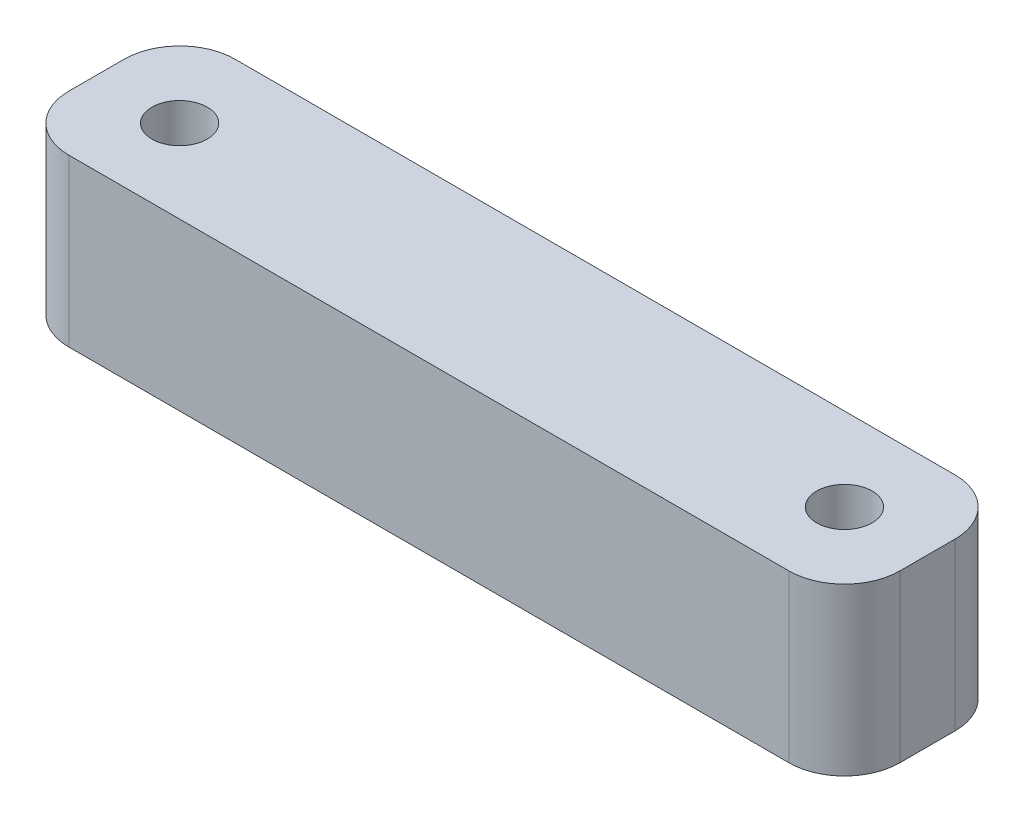
ISO-10303-21;
HEADER;
FILE_DESCRIPTION(('STEP AP214'),'2;1');
FILE_NAME('part.step','',(''),(''),'','','');
FILE_SCHEMA(('AUTOMOTIVE_DESIGN { 1 0 10303 214 1 1 1 1 }'));
ENDSEC;
DATA;
#1=APPLICATION_CONTEXT('core data for automotive mechanical design processes');
#2=APPLICATION_PROTOCOL_DEFINITION('international standard','automotive_design',2000,#1);
#3=PRODUCT_CONTEXT('',#1,'mechanical');
#4=PRODUCT('Part','Part','',(#3));
#5=PRODUCT_RELATED_PRODUCT_CATEGORY('part','',(#4));
#6=PRODUCT_DEFINITION_FORMATION('','',#4);
#7=PRODUCT_DEFINITION_CONTEXT('part definition',#1,'design');
#8=PRODUCT_DEFINITION('design','',#6,#7);
#9=PRODUCT_DEFINITION_SHAPE('','',#8);
#10=(LENGTH_UNIT() NAMED_UNIT(*) SI_UNIT(.MILLI.,.METRE.));
#11=(NAMED_UNIT(*) PLANE_ANGLE_UNIT() SI_UNIT($,.RADIAN.));
#12=(NAMED_UNIT(*) SI_UNIT($,.STERADIAN.) SOLID_ANGLE_UNIT());
#13=UNCERTAINTY_MEASURE_WITH_UNIT(LENGTH_MEASURE(1.E-05),#10,'distance_accuracy_value','');
#14=(GEOMETRIC_REPRESENTATION_CONTEXT(3) GLOBAL_UNCERTAINTY_ASSIGNED_CONTEXT((#13)) GLOBAL_UNIT_ASSIGNED_CONTEXT((#10,
#11,#12)) REPRESENTATION_CONTEXT('',''));
#15=CARTESIAN_POINT('',(0.,0.,0.));
#16=DIRECTION('',(0.,0.,1.));
#17=DIRECTION('',(1.,0.,0.));
#18=AXIS2_PLACEMENT_3D('',#15,#16,#17);
#19=CARTESIAN_POINT('',(0.,30.,15.));
#20=DIRECTION('',(0.,0.,-1.));
#21=DIRECTION('',(-1.,0.,0.));
#22=AXIS2_PLACEMENT_3D('',#19,#20,#21);
#23=PLANE('',#22);
#24=DIRECTION('',(1.,0.,0.));
#25=VECTOR('',#24,1.);
#26=CARTESIAN_POINT('',(0.,30.,15.));
#27=LINE('',#26,#25);
#28=CARTESIAN_POINT('',(-65.,30.,15.));
#29=VERTEX_POINT('',#28);
#30=CARTESIAN_POINT('',(65.,30.,15.));
#31=VERTEX_POINT('',#30);
#32=EDGE_CURVE('E137',#29,#31,#27,.T.);
#33=ORIENTED_EDGE('',*,*,#32,.F.);
#34=DIRECTION('',(0.,-1.,0.));
#35=VECTOR('',#34,1.);
#36=CARTESIAN_POINT('',(-65.,30.,15.));
#37=LINE('',#36,#35);
#38=CARTESIAN_POINT('',(-65.,0.,15.));
#39=VERTEX_POINT('',#38);
#40=EDGE_CURVE('E156',#29,#39,#37,.T.);
#41=ORIENTED_EDGE('',*,*,#40,.T.);
#42=DIRECTION('',(1.,0.,0.));
#43=VECTOR('',#42,1.);
#44=CARTESIAN_POINT('',(0.,0.,15.));
#45=LINE('',#44,#43);
#46=CARTESIAN_POINT('',(65.,0.,15.));
#47=VERTEX_POINT('',#46);
#48=EDGE_CURVE('E165',#39,#47,#45,.T.);
#49=ORIENTED_EDGE('',*,*,#48,.T.);
#50=DIRECTION('',(0.,-1.,0.));
#51=VECTOR('',#50,1.);
#52=CARTESIAN_POINT('',(65.,30.,15.));
#53=LINE('',#52,#51);
#54=EDGE_CURVE('E154',#47,#31,#53,.F.);
#55=ORIENTED_EDGE('',*,*,#54,.T.);
#56=EDGE_LOOP('',(#33,#41,#49,#55));
#57=FACE_BOUND('',#56,.T.);
#58=ADVANCED_FACE('F33',(#57),#23,.F.);
#59=CARTESIAN_POINT('',(75.,30.,0.));
#60=DIRECTION('',(1.,0.,0.));
#61=DIRECTION('',(0.,0.,-1.));
#62=AXIS2_PLACEMENT_3D('',#59,#60,#61);
#63=PLANE('',#62);
#64=DIRECTION('',(0.,0.,1.));
#65=VECTOR('',#64,1.);
#66=CARTESIAN_POINT('',(75.,0.,0.));
#67=LINE('',#66,#65);
#68=CARTESIAN_POINT('',(75.,0.,-5.));
#69=VERTEX_POINT('',#68);
#70=CARTESIAN_POINT('',(75.,0.,5.));
#71=VERTEX_POINT('',#70);
#72=EDGE_CURVE('E131',#69,#71,#67,.T.);
#73=ORIENTED_EDGE('',*,*,#72,.F.);
#74=DIRECTION('',(0.,-1.,0.));
#75=VECTOR('',#74,1.);
#76=CARTESIAN_POINT('',(75.,30.,-5.));
#77=LINE('',#76,#75);
#78=CARTESIAN_POINT('',(75.,30.,-5.));
#79=VERTEX_POINT('',#78);
#80=EDGE_CURVE('E11',#69,#79,#77,.F.);
#81=ORIENTED_EDGE('',*,*,#80,.T.);
#82=DIRECTION('',(0.,0.,1.));
#83=VECTOR('',#82,1.);
#84=CARTESIAN_POINT('',(75.,30.,0.));
#85=LINE('',#84,#83);
#86=CARTESIAN_POINT('',(75.,30.,5.));
#87=VERTEX_POINT('',#86);
#88=EDGE_CURVE('E162',#79,#87,#85,.T.);
#89=ORIENTED_EDGE('',*,*,#88,.T.);
#90=DIRECTION('',(0.,-1.,0.));
#91=VECTOR('',#90,1.);
#92=CARTESIAN_POINT('',(75.,0.,5.));
#93=LINE('',#92,#91);
#94=EDGE_CURVE('E41',#87,#71,#93,.T.);
#95=ORIENTED_EDGE('',*,*,#94,.T.);
#96=EDGE_LOOP('',(#73,#81,#89,#95));
#97=FACE_BOUND('',#96,.T.);
#98=ADVANCED_FACE('F161',(#97),#63,.T.);
#99=CARTESIAN_POINT('',(0.,30.,-15.));
#100=DIRECTION('',(0.,0.,-1.));
#101=DIRECTION('',(-1.,0.,0.));
#102=AXIS2_PLACEMENT_3D('',#99,#100,#101);
#103=PLANE('',#102);
#104=DIRECTION('',(1.,0.,0.));
#105=VECTOR('',#104,1.);
#106=CARTESIAN_POINT('',(0.,0.,-15.));
#107=LINE('',#106,#105);
#108=CARTESIAN_POINT('',(-65.,0.,-15.));
#109=VERTEX_POINT('',#108);
#110=CARTESIAN_POINT('',(65.,0.,-15.));
#111=VERTEX_POINT('',#110);
#112=EDGE_CURVE('E126',#109,#111,#107,.T.);
#113=ORIENTED_EDGE('',*,*,#112,.F.);
#114=DIRECTION('',(0.,-1.,0.));
#115=VECTOR('',#114,1.);
#116=CARTESIAN_POINT('',(-65.,30.,-15.));
#117=LINE('',#116,#115);
#118=CARTESIAN_POINT('',(-65.,30.,-15.));
#119=VERTEX_POINT('',#118);
#120=EDGE_CURVE('E103',#109,#119,#117,.F.);
#121=ORIENTED_EDGE('',*,*,#120,.T.);
#122=DIRECTION('',(1.,0.,0.));
#123=VECTOR('',#122,1.);
#124=CARTESIAN_POINT('',(0.,30.,-15.));
#125=LINE('',#124,#123);
#126=CARTESIAN_POINT('',(65.,30.,-15.));
#127=VERTEX_POINT('',#126);
#128=EDGE_CURVE('E174',#119,#127,#125,.T.);
#129=ORIENTED_EDGE('',*,*,#128,.T.);
#130=DIRECTION('',(0.,-1.,0.));
#131=VECTOR('',#130,1.);
#132=CARTESIAN_POINT('',(65.,30.,-15.));
#133=LINE('',#132,#131);
#134=EDGE_CURVE('E108',#127,#111,#133,.T.);
#135=ORIENTED_EDGE('',*,*,#134,.T.);
#136=EDGE_LOOP('',(#113,#121,#129,#135));
#137=FACE_BOUND('',#136,.T.);
#138=ADVANCED_FACE('F191',(#137),#103,.T.);
#139=CARTESIAN_POINT('',(-60.,30.,-1.64798730217797E-13));
#140=DIRECTION('',(0.,-1.,0.));
#141=DIRECTION('',(0.,0.,-1.));
#142=AXIS2_PLACEMENT_3D('',#139,#140,#141);
#143=CYLINDRICAL_SURFACE('',#142,5.00000000000001);
#144=CARTESIAN_POINT('',(-60.,30.,-1.64798730217797E-13));
#145=DIRECTION('',(0.,1.,0.));
#146=DIRECTION('',(0.,0.,1.));
#147=AXIS2_PLACEMENT_3D('',#144,#145,#146);
#148=CIRCLE('',#147,5.00000000000001);
#149=CARTESIAN_POINT('',(-60.,30.,4.99999999999984));
#150=VERTEX_POINT('',#149);
#151=EDGE_CURVE('E170',#150,#150,#148,.F.);
#152=ORIENTED_EDGE('',*,*,#151,.F.);
#153=EDGE_LOOP('',(#152));
#154=FACE_BOUND('',#153,.T.);
#155=CARTESIAN_POINT('',(-60.,0.,-1.64798730217797E-13));
#156=DIRECTION('',(0.,1.,0.));
#157=DIRECTION('',(0.,0.,1.));
#158=AXIS2_PLACEMENT_3D('',#155,#156,#157);
#159=CIRCLE('',#158,5.00000000000001);
#160=CARTESIAN_POINT('',(-60.,0.,4.99999999999984));
#161=VERTEX_POINT('',#160);
#162=EDGE_CURVE('E125',#161,#161,#159,.F.);
#163=ORIENTED_EDGE('',*,*,#162,.T.);
#164=EDGE_LOOP('',(#163));
#165=FACE_BOUND('',#164,.T.);
#166=ADVANCED_FACE('F222',(#154,#165),#143,.F.);
#167=CARTESIAN_POINT('',(-75.,30.,-2.08166817117217E-13));
#168=DIRECTION('',(1.,0.,0.));
#169=DIRECTION('',(0.,0.,-1.));
#170=AXIS2_PLACEMENT_3D('',#167,#168,#169);
#171=PLANE('',#170);
#172=DIRECTION('',(0.,0.,1.));
#173=VECTOR('',#172,1.);
#174=CARTESIAN_POINT('',(-75.,30.,-2.08166817117217E-13));
#175=LINE('',#174,#173);
#176=CARTESIAN_POINT('',(-75.,30.,-5.00000000000003));
#177=VERTEX_POINT('',#176);
#178=CARTESIAN_POINT('',(-75.,30.,4.99999999999997));
#179=VERTEX_POINT('',#178);
#180=EDGE_CURVE('E118',#177,#179,#175,.T.);
#181=ORIENTED_EDGE('',*,*,#180,.F.);
#182=DIRECTION('',(0.,-1.,0.));
#183=VECTOR('',#182,1.);
#184=CARTESIAN_POINT('',(-75.,0.,-5.00000000000003));
#185=LINE('',#184,#183);
#186=CARTESIAN_POINT('',(-75.,0.,-5.00000000000003));
#187=VERTEX_POINT('',#186);
#188=EDGE_CURVE('E102',#177,#187,#185,.T.);
#189=ORIENTED_EDGE('',*,*,#188,.T.);
#190=DIRECTION('',(0.,0.,1.));
#191=VECTOR('',#190,1.);
#192=CARTESIAN_POINT('',(-75.,0.,-2.08166817117217E-13));
#193=LINE('',#192,#191);
#194=CARTESIAN_POINT('',(-75.,0.,4.99999999999997));
#195=VERTEX_POINT('',#194);
#196=EDGE_CURVE('E115',#187,#195,#193,.T.);
#197=ORIENTED_EDGE('',*,*,#196,.T.);
#198=DIRECTION('',(0.,-1.,0.));
#199=VECTOR('',#198,1.);
#200=CARTESIAN_POINT('',(-75.,30.,4.99999999999997));
#201=LINE('',#200,#199);
#202=EDGE_CURVE('E120',#195,#179,#201,.F.);
#203=ORIENTED_EDGE('',*,*,#202,.T.);
#204=EDGE_LOOP('',(#181,#189,#197,#203));
#205=FACE_BOUND('',#204,.T.);
#206=ADVANCED_FACE('F114',(#205),#171,.F.);
#207=CARTESIAN_POINT('',(60.,30.,0.));
#208=DIRECTION('',(0.,-1.,0.));
#209=DIRECTION('',(0.,0.,-1.));
#210=AXIS2_PLACEMENT_3D('',#207,#208,#209);
#211=CYLINDRICAL_SURFACE('',#210,5.);
#212=CARTESIAN_POINT('',(60.,30.,0.));
#213=DIRECTION('',(0.,1.,0.));
#214=DIRECTION('',(0.,0.,1.));
#215=AXIS2_PLACEMENT_3D('',#212,#213,#214);
#216=CIRCLE('',#215,5.);
#217=CARTESIAN_POINT('',(60.,30.,5.00000000000001));
#218=VERTEX_POINT('',#217);
#219=EDGE_CURVE('E138',#218,#218,#216,.T.);
#220=ORIENTED_EDGE('',*,*,#219,.T.);
#221=EDGE_LOOP('',(#220));
#222=FACE_BOUND('',#221,.T.);
#223=CARTESIAN_POINT('',(60.,0.,0.));
#224=DIRECTION('',(0.,1.,0.));
#225=DIRECTION('',(0.,0.,1.));
#226=AXIS2_PLACEMENT_3D('',#223,#224,#225);
#227=CIRCLE('',#226,5.);
#228=CARTESIAN_POINT('',(60.,0.,5.00000000000001));
#229=VERTEX_POINT('',#228);
#230=EDGE_CURVE('E129',#229,#229,#227,.T.);
#231=ORIENTED_EDGE('',*,*,#230,.F.);
#232=EDGE_LOOP('',(#231));
#233=FACE_BOUND('',#232,.T.);
#234=ADVANCED_FACE('F216',(#222,#233),#211,.F.);
#235=CARTESIAN_POINT('',(0.,30.,0.));
#236=DIRECTION('',(0.,1.,0.));
#237=DIRECTION('',(0.,0.,1.));
#238=AXIS2_PLACEMENT_3D('',#235,#236,#237);
#239=PLANE('',#238);
#240=ORIENTED_EDGE('',*,*,#128,.F.);
#241=CARTESIAN_POINT('',(-65.,30.,-5.));
#242=DIRECTION('',(0.,1.,0.));
#243=DIRECTION('',(0.,0.,1.));
#244=AXIS2_PLACEMENT_3D('',#241,#242,#243);
#245=CIRCLE('',#244,10.);
#246=EDGE_CURVE('E152',#119,#177,#245,.T.);
#247=ORIENTED_EDGE('',*,*,#246,.T.);
#248=ORIENTED_EDGE('',*,*,#180,.T.);
#249=CARTESIAN_POINT('',(-65.,30.,5.));
#250=DIRECTION('',(0.,1.,0.));
#251=DIRECTION('',(0.,0.,1.));
#252=AXIS2_PLACEMENT_3D('',#249,#250,#251);
#253=CIRCLE('',#252,10.);
#254=EDGE_CURVE('E150',#179,#29,#253,.T.);
#255=ORIENTED_EDGE('',*,*,#254,.T.);
#256=ORIENTED_EDGE('',*,*,#32,.T.);
#257=CARTESIAN_POINT('',(65.,30.,5.));
#258=DIRECTION('',(0.,1.,0.));
#259=DIRECTION('',(0.,0.,1.));
#260=AXIS2_PLACEMENT_3D('',#257,#258,#259);
#261=CIRCLE('',#260,10.);
#262=EDGE_CURVE('E48',#31,#87,#261,.T.);
#263=ORIENTED_EDGE('',*,*,#262,.T.);
#264=ORIENTED_EDGE('',*,*,#88,.F.);
#265=CARTESIAN_POINT('',(65.,30.,-5.));
#266=DIRECTION('',(0.,1.,0.));
#267=DIRECTION('',(0.,0.,1.));
#268=AXIS2_PLACEMENT_3D('',#265,#266,#267);
#269=CIRCLE('',#268,10.);
#270=EDGE_CURVE('E148',#79,#127,#269,.T.);
#271=ORIENTED_EDGE('',*,*,#270,.T.);
#272=EDGE_LOOP('',(#240,#247,#248,#255,#256,#263,#264,#271));
#273=FACE_BOUND('',#272,.T.);
#274=ORIENTED_EDGE('',*,*,#151,.T.);
#275=EDGE_LOOP('',(#274));
#276=FACE_BOUND('',#275,.T.);
#277=ORIENTED_EDGE('',*,*,#219,.F.);
#278=EDGE_LOOP('',(#277));
#279=FACE_BOUND('',#278,.T.);
#280=ADVANCED_FACE('F180',(#273,#276,#279),#239,.T.);
#281=CARTESIAN_POINT('',(0.,0.,0.));
#282=DIRECTION('',(0.,1.,0.));
#283=DIRECTION('',(0.,0.,1.));
#284=AXIS2_PLACEMENT_3D('',#281,#282,#283);
#285=PLANE('',#284);
#286=ORIENTED_EDGE('',*,*,#196,.F.);
#287=CARTESIAN_POINT('',(-65.,0.,-5.));
#288=DIRECTION('',(0.,1.,0.));
#289=DIRECTION('',(0.,0.,1.));
#290=AXIS2_PLACEMENT_3D('',#287,#288,#289);
#291=CIRCLE('',#290,10.);
#292=EDGE_CURVE('E98',#187,#109,#291,.F.);
#293=ORIENTED_EDGE('',*,*,#292,.T.);
#294=ORIENTED_EDGE('',*,*,#112,.T.);
#295=CARTESIAN_POINT('',(65.,0.,-5.));
#296=DIRECTION('',(0.,1.,0.));
#297=DIRECTION('',(0.,0.,1.));
#298=AXIS2_PLACEMENT_3D('',#295,#296,#297);
#299=CIRCLE('',#298,10.);
#300=EDGE_CURVE('E141',#111,#69,#299,.F.);
#301=ORIENTED_EDGE('',*,*,#300,.T.);
#302=ORIENTED_EDGE('',*,*,#72,.T.);
#303=CARTESIAN_POINT('',(65.,0.,5.));
#304=DIRECTION('',(0.,1.,0.));
#305=DIRECTION('',(0.,0.,1.));
#306=AXIS2_PLACEMENT_3D('',#303,#304,#305);
#307=CIRCLE('',#306,10.);
#308=EDGE_CURVE('E119',#71,#47,#307,.F.);
#309=ORIENTED_EDGE('',*,*,#308,.T.);
#310=ORIENTED_EDGE('',*,*,#48,.F.);
#311=CARTESIAN_POINT('',(-65.,0.,5.));
#312=DIRECTION('',(0.,1.,0.));
#313=DIRECTION('',(0.,0.,1.));
#314=AXIS2_PLACEMENT_3D('',#311,#312,#313);
#315=CIRCLE('',#314,10.);
#316=EDGE_CURVE('E109',#39,#195,#315,.F.);
#317=ORIENTED_EDGE('',*,*,#316,.T.);
#318=EDGE_LOOP('',(#286,#293,#294,#301,#302,#309,#310,#317));
#319=FACE_BOUND('',#318,.T.);
#320=ORIENTED_EDGE('',*,*,#162,.F.);
#321=EDGE_LOOP('',(#320));
#322=FACE_BOUND('',#321,.T.);
#323=ORIENTED_EDGE('',*,*,#230,.T.);
#324=EDGE_LOOP('',(#323));
#325=FACE_BOUND('',#324,.T.);
#326=ADVANCED_FACE('F122',(#319,#322,#325),#285,.F.);
#327=CARTESIAN_POINT('',(-65.,30.,-5.));
#328=DIRECTION('',(0.,1.,0.));
#329=DIRECTION('',(0.,0.,1.));
#330=AXIS2_PLACEMENT_3D('',#327,#328,#329);
#331=CYLINDRICAL_SURFACE('',#330,10.);
#332=ORIENTED_EDGE('',*,*,#246,.F.);
#333=ORIENTED_EDGE('',*,*,#120,.F.);
#334=ORIENTED_EDGE('',*,*,#292,.F.);
#335=ORIENTED_EDGE('',*,*,#188,.F.);
#336=EDGE_LOOP('',(#332,#333,#334,#335));
#337=FACE_BOUND('',#336,.T.);
#338=ADVANCED_FACE('F101',(#337),#331,.T.);
#339=CARTESIAN_POINT('',(-65.,30.,5.));
#340=DIRECTION('',(0.,-1.,0.));
#341=DIRECTION('',(0.,0.,-1.));
#342=AXIS2_PLACEMENT_3D('',#339,#340,#341);
#343=CYLINDRICAL_SURFACE('',#342,10.);
#344=ORIENTED_EDGE('',*,*,#254,.F.);
#345=ORIENTED_EDGE('',*,*,#202,.F.);
#346=ORIENTED_EDGE('',*,*,#316,.F.);
#347=ORIENTED_EDGE('',*,*,#40,.F.);
#348=EDGE_LOOP('',(#344,#345,#346,#347));
#349=FACE_BOUND('',#348,.T.);
#350=ADVANCED_FACE('F187',(#349),#343,.T.);
#351=CARTESIAN_POINT('',(65.,30.,-5.));
#352=DIRECTION('',(0.,-1.,0.));
#353=DIRECTION('',(0.,0.,-1.));
#354=AXIS2_PLACEMENT_3D('',#351,#352,#353);
#355=CYLINDRICAL_SURFACE('',#354,10.);
#356=ORIENTED_EDGE('',*,*,#270,.F.);
#357=ORIENTED_EDGE('',*,*,#80,.F.);
#358=ORIENTED_EDGE('',*,*,#300,.F.);
#359=ORIENTED_EDGE('',*,*,#134,.F.);
#360=EDGE_LOOP('',(#356,#357,#358,#359));
#361=FACE_BOUND('',#360,.T.);
#362=ADVANCED_FACE('F193',(#361),#355,.T.);
#363=CARTESIAN_POINT('',(65.,30.,5.));
#364=DIRECTION('',(0.,1.,0.));
#365=DIRECTION('',(0.,0.,1.));
#366=AXIS2_PLACEMENT_3D('',#363,#364,#365);
#367=CYLINDRICAL_SURFACE('',#366,10.);
#368=ORIENTED_EDGE('',*,*,#262,.F.);
#369=ORIENTED_EDGE('',*,*,#54,.F.);
#370=ORIENTED_EDGE('',*,*,#308,.F.);
#371=ORIENTED_EDGE('',*,*,#94,.F.);
#372=EDGE_LOOP('',(#368,#369,#370,#371));
#373=FACE_BOUND('',#372,.T.);
#374=ADVANCED_FACE('F35',(#373),#367,.T.);
#375=CLOSED_SHELL('',(#58,#98,#138,#166,#206,#234,#280,#326,#338,#350,#362,#374));
#376=MANIFOLD_SOLID_BREP('B2',#375);
#377=ADVANCED_BREP_SHAPE_REPRESENTATION('',(#18,#376),#14);
#378=SHAPE_DEFINITION_REPRESENTATION(#9,#377);
ENDSEC;
END-ISO-10303-21;
